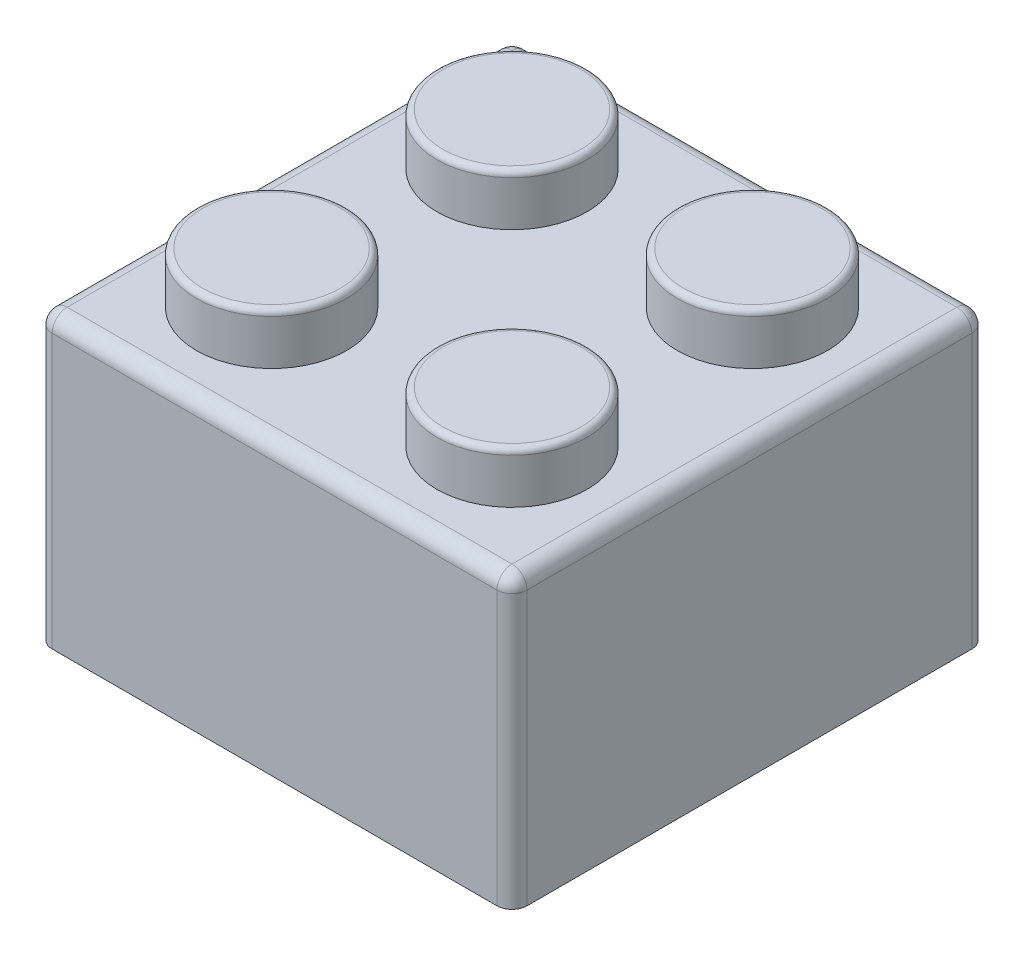
ISO-10303-21;
HEADER;
FILE_DESCRIPTION(('STEP AP214'),'2;1');
FILE_NAME('part.step','',(''),(''),'','','');
FILE_SCHEMA(('AUTOMOTIVE_DESIGN { 1 0 10303 214 1 1 1 1 }'));
ENDSEC;
DATA;
#1=APPLICATION_CONTEXT('core data for automotive mechanical design processes');
#2=APPLICATION_PROTOCOL_DEFINITION('international standard','automotive_design',2000,#1);
#3=PRODUCT_CONTEXT('',#1,'mechanical');
#4=PRODUCT('Part','Part','',(#3));
#5=PRODUCT_RELATED_PRODUCT_CATEGORY('part','',(#4));
#6=PRODUCT_DEFINITION_FORMATION('','',#4);
#7=PRODUCT_DEFINITION_CONTEXT('part definition',#1,'design');
#8=PRODUCT_DEFINITION('design','',#6,#7);
#9=PRODUCT_DEFINITION_SHAPE('','',#8);
#10=(LENGTH_UNIT() NAMED_UNIT(*) SI_UNIT(.MILLI.,.METRE.));
#11=(NAMED_UNIT(*) PLANE_ANGLE_UNIT() SI_UNIT($,.RADIAN.));
#12=(NAMED_UNIT(*) SI_UNIT($,.STERADIAN.) SOLID_ANGLE_UNIT());
#13=UNCERTAINTY_MEASURE_WITH_UNIT(LENGTH_MEASURE(1.E-05),#10,'distance_accuracy_value','');
#14=(GEOMETRIC_REPRESENTATION_CONTEXT(3) GLOBAL_UNCERTAINTY_ASSIGNED_CONTEXT((#13)) GLOBAL_UNIT_ASSIGNED_CONTEXT((#10,
#11,#12)) REPRESENTATION_CONTEXT('',''));
#15=CARTESIAN_POINT('',(0.,0.,0.));
#16=DIRECTION('',(0.,0.,1.));
#17=DIRECTION('',(1.,0.,0.));
#18=AXIS2_PLACEMENT_3D('',#15,#16,#17);
#19=CARTESIAN_POINT('',(4.37456896551724,11.1,5.32801724137931));
#20=DIRECTION('',(0.,1.,0.));
#21=DIRECTION('',(0.,0.,1.));
#22=AXIS2_PLACEMENT_3D('',#19,#20,#21);
#23=TOROIDAL_SURFACE('',#22,2.3,0.2);
#24=CARTESIAN_POINT('',(4.37456896551724,11.1,5.32801724137931));
#25=DIRECTION('',(0.,1.,0.));
#26=DIRECTION('',(0.,0.,1.));
#27=AXIS2_PLACEMENT_3D('',#24,#25,#26);
#28=CIRCLE('',#27,2.5);
#29=CARTESIAN_POINT('',(4.37456896551724,11.1,7.82801724137931));
#30=VERTEX_POINT('',#29);
#31=EDGE_CURVE('E281',#30,#30,#28,.F.);
#32=ORIENTED_EDGE('',*,*,#31,.F.);
#33=EDGE_LOOP('',(#32));
#34=FACE_BOUND('',#33,.T.);
#35=CARTESIAN_POINT('',(4.37456896551724,11.3,5.32801724137931));
#36=DIRECTION('',(0.,1.,0.));
#37=DIRECTION('',(0.,0.,1.));
#38=AXIS2_PLACEMENT_3D('',#35,#36,#37);
#39=CIRCLE('',#38,2.3);
#40=CARTESIAN_POINT('',(4.37456896551724,11.3,7.62801724137931));
#41=VERTEX_POINT('',#40);
#42=EDGE_CURVE('E40',#41,#41,#39,.T.);
#43=ORIENTED_EDGE('',*,*,#42,.F.);
#44=EDGE_LOOP('',(#43));
#45=FACE_BOUND('',#44,.T.);
#46=ADVANCED_FACE('F33',(#34,#45),#23,.T.);
#47=CARTESIAN_POINT('',(4.37456896551724,11.3,5.32801724137931));
#48=DIRECTION('',(0.,1.,0.));
#49=DIRECTION('',(0.,0.,1.));
#50=AXIS2_PLACEMENT_3D('',#47,#48,#49);
#51=PLANE('',#50);
#52=ORIENTED_EDGE('',*,*,#42,.T.);
#53=EDGE_LOOP('',(#52));
#54=FACE_BOUND('',#53,.T.);
#55=ADVANCED_FACE('F286',(#54),#51,.T.);
#56=CARTESIAN_POINT('',(4.37456896551724,11.3,5.32801724137931));
#57=DIRECTION('',(0.,-1.,0.));
#58=DIRECTION('',(0.,0.,-1.));
#59=AXIS2_PLACEMENT_3D('',#56,#57,#58);
#60=CYLINDRICAL_SURFACE('',#59,2.5);
#61=ORIENTED_EDGE('',*,*,#31,.T.);
#62=EDGE_LOOP('',(#61));
#63=FACE_BOUND('',#62,.T.);
#64=CARTESIAN_POINT('',(4.37456896551724,9.6,5.32801724137931));
#65=DIRECTION('',(0.,1.,0.));
#66=DIRECTION('',(0.,0.,1.));
#67=AXIS2_PLACEMENT_3D('',#64,#65,#66);
#68=CIRCLE('',#67,2.5);
#69=CARTESIAN_POINT('',(4.37456896551724,9.6,7.82801724137931));
#70=VERTEX_POINT('',#69);
#71=EDGE_CURVE('E278',#70,#70,#68,.T.);
#72=ORIENTED_EDGE('',*,*,#71,.T.);
#73=EDGE_LOOP('',(#72));
#74=FACE_BOUND('',#73,.T.);
#75=ADVANCED_FACE('F293',(#63,#74),#60,.T.);
#76=CARTESIAN_POINT('',(-3.62543103448276,11.1,5.32801724137931));
#77=DIRECTION('',(0.,1.,0.));
#78=DIRECTION('',(0.,0.,1.));
#79=AXIS2_PLACEMENT_3D('',#76,#77,#78);
#80=TOROIDAL_SURFACE('',#79,2.3,0.2);
#81=CARTESIAN_POINT('',(-3.62543103448276,11.1,5.32801724137931));
#82=DIRECTION('',(0.,1.,0.));
#83=DIRECTION('',(0.,0.,1.));
#84=AXIS2_PLACEMENT_3D('',#81,#82,#83);
#85=CIRCLE('',#84,2.5);
#86=CARTESIAN_POINT('',(-3.62543103448276,11.1,7.82801724137932));
#87=VERTEX_POINT('',#86);
#88=EDGE_CURVE('E272',#87,#87,#85,.F.);
#89=ORIENTED_EDGE('',*,*,#88,.F.);
#90=EDGE_LOOP('',(#89));
#91=FACE_BOUND('',#90,.T.);
#92=CARTESIAN_POINT('',(-3.62543103448276,11.3,5.32801724137931));
#93=DIRECTION('',(0.,1.,0.));
#94=DIRECTION('',(0.,0.,1.));
#95=AXIS2_PLACEMENT_3D('',#92,#93,#94);
#96=CIRCLE('',#95,2.3);
#97=CARTESIAN_POINT('',(-3.62543103448276,11.3,7.62801724137931));
#98=VERTEX_POINT('',#97);
#99=EDGE_CURVE('E275',#98,#98,#96,.T.);
#100=ORIENTED_EDGE('',*,*,#99,.F.);
#101=EDGE_LOOP('',(#100));
#102=FACE_BOUND('',#101,.T.);
#103=ADVANCED_FACE('F298',(#91,#102),#80,.T.);
#104=CARTESIAN_POINT('',(-3.62543103448276,11.3,5.32801724137931));
#105=DIRECTION('',(0.,1.,0.));
#106=DIRECTION('',(0.,0.,1.));
#107=AXIS2_PLACEMENT_3D('',#104,#105,#106);
#108=PLANE('',#107);
#109=ORIENTED_EDGE('',*,*,#99,.T.);
#110=EDGE_LOOP('',(#109));
#111=FACE_BOUND('',#110,.T.);
#112=ADVANCED_FACE('F389',(#111),#108,.T.);
#113=CARTESIAN_POINT('',(-3.62543103448276,11.3,5.32801724137931));
#114=DIRECTION('',(0.,-1.,0.));
#115=DIRECTION('',(0.,0.,-1.));
#116=AXIS2_PLACEMENT_3D('',#113,#114,#115);
#117=CYLINDRICAL_SURFACE('',#116,2.5);
#118=ORIENTED_EDGE('',*,*,#88,.T.);
#119=EDGE_LOOP('',(#118));
#120=FACE_BOUND('',#119,.T.);
#121=CARTESIAN_POINT('',(-3.62543103448276,9.6,5.32801724137931));
#122=DIRECTION('',(0.,1.,0.));
#123=DIRECTION('',(0.,0.,1.));
#124=AXIS2_PLACEMENT_3D('',#121,#122,#123);
#125=CIRCLE('',#124,2.5);
#126=CARTESIAN_POINT('',(-3.62543103448276,9.6,7.82801724137932));
#127=VERTEX_POINT('',#126);
#128=EDGE_CURVE('E269',#127,#127,#125,.T.);
#129=ORIENTED_EDGE('',*,*,#128,.T.);
#130=EDGE_LOOP('',(#129));
#131=FACE_BOUND('',#130,.T.);
#132=ADVANCED_FACE('F333',(#120,#131),#117,.T.);
#133=CARTESIAN_POINT('',(-7.52543103448276,9.6,-6.57198275862069));
#134=DIRECTION('',(1.,0.,0.));
#135=DIRECTION('',(0.,0.,-1.));
#136=AXIS2_PLACEMENT_3D('',#133,#134,#135);
#137=PLANE('',#136);
#138=DIRECTION('',(0.,0.,1.));
#139=VECTOR('',#138,1.);
#140=CARTESIAN_POINT('',(-7.52543103448276,9.1,-6.57198275862069));
#141=LINE('',#140,#139);
#142=CARTESIAN_POINT('',(-7.52543103448276,9.1,8.72801724137931));
#143=VERTEX_POINT('',#142);
#144=CARTESIAN_POINT('',(-7.52543103448276,9.1,-6.07198275862069));
#145=VERTEX_POINT('',#144);
#146=EDGE_CURVE('E213',#143,#145,#141,.F.);
#147=ORIENTED_EDGE('',*,*,#146,.T.);
#148=DIRECTION('',(0.,-1.,0.));
#149=VECTOR('',#148,1.);
#150=CARTESIAN_POINT('',(-7.52543103448276,9.6,-6.07198275862069));
#151=LINE('',#150,#149);
#152=CARTESIAN_POINT('',(-7.52543103448276,0.,-6.07198275862069));
#153=VERTEX_POINT('',#152);
#154=EDGE_CURVE('E215',#145,#153,#151,.T.);
#155=ORIENTED_EDGE('',*,*,#154,.T.);
#156=DIRECTION('',(0.,0.,1.));
#157=VECTOR('',#156,1.);
#158=CARTESIAN_POINT('',(-7.52543103448276,0.,-6.57198275862069));
#159=LINE('',#158,#157);
#160=CARTESIAN_POINT('',(-7.52543103448276,0.,8.72801724137931));
#161=VERTEX_POINT('',#160);
#162=EDGE_CURVE('E177',#153,#161,#159,.T.);
#163=ORIENTED_EDGE('',*,*,#162,.T.);
#164=DIRECTION('',(0.,-1.,0.));
#165=VECTOR('',#164,1.);
#166=CARTESIAN_POINT('',(-7.52543103448276,9.6,8.72801724137931));
#167=LINE('',#166,#165);
#168=EDGE_CURVE('E211',#161,#143,#167,.F.);
#169=ORIENTED_EDGE('',*,*,#168,.T.);
#170=EDGE_LOOP('',(#147,#155,#163,#169));
#171=FACE_BOUND('',#170,.T.);
#172=ADVANCED_FACE('F329',(#171),#137,.F.);
#173=CARTESIAN_POINT('',(-7.52543103448276,9.6,9.22801724137931));
#174=DIRECTION('',(0.,0.,-1.));
#175=DIRECTION('',(-1.,0.,0.));
#176=AXIS2_PLACEMENT_3D('',#173,#174,#175);
#177=PLANE('',#176);
#178=DIRECTION('',(1.,0.,0.));
#179=VECTOR('',#178,1.);
#180=CARTESIAN_POINT('',(-7.52543103448276,0.,9.22801724137931));
#181=LINE('',#180,#179);
#182=CARTESIAN_POINT('',(-7.02543103448276,0.,9.22801724137931));
#183=VERTEX_POINT('',#182);
#184=CARTESIAN_POINT('',(7.77456896551725,0.,9.22801724137931));
#185=VERTEX_POINT('',#184);
#186=EDGE_CURVE('E180',#183,#185,#181,.T.);
#187=ORIENTED_EDGE('',*,*,#186,.T.);
#188=DIRECTION('',(0.,-1.,0.));
#189=VECTOR('',#188,1.);
#190=CARTESIAN_POINT('',(7.77456896551725,9.6,9.22801724137931));
#191=LINE('',#190,#189);
#192=CARTESIAN_POINT('',(7.77456896551725,9.1,9.22801724137931));
#193=VERTEX_POINT('',#192);
#194=EDGE_CURVE('E221',#185,#193,#191,.F.);
#195=ORIENTED_EDGE('',*,*,#194,.T.);
#196=DIRECTION('',(1.,0.,0.));
#197=VECTOR('',#196,1.);
#198=CARTESIAN_POINT('',(-7.52543103448276,9.1,9.22801724137931));
#199=LINE('',#198,#197);
#200=CARTESIAN_POINT('',(-7.02543103448276,9.1,9.22801724137931));
#201=VERTEX_POINT('',#200);
#202=EDGE_CURVE('E219',#193,#201,#199,.F.);
#203=ORIENTED_EDGE('',*,*,#202,.T.);
#204=DIRECTION('',(0.,-1.,0.));
#205=VECTOR('',#204,1.);
#206=CARTESIAN_POINT('',(-7.02543103448276,9.6,9.22801724137931));
#207=LINE('',#206,#205);
#208=EDGE_CURVE('E217',#201,#183,#207,.T.);
#209=ORIENTED_EDGE('',*,*,#208,.T.);
#210=EDGE_LOOP('',(#187,#195,#203,#209));
#211=FACE_BOUND('',#210,.T.);
#212=ADVANCED_FACE('F325',(#211),#177,.F.);
#213=CARTESIAN_POINT('',(8.27456896551725,9.6,-6.57198275862069));
#214=DIRECTION('',(-1.,0.,0.));
#215=DIRECTION('',(0.,0.,1.));
#216=AXIS2_PLACEMENT_3D('',#213,#214,#215);
#217=PLANE('',#216);
#218=DIRECTION('',(0.,0.,-1.));
#219=VECTOR('',#218,1.);
#220=CARTESIAN_POINT('',(8.27456896551725,0.,-6.57198275862069));
#221=LINE('',#220,#219);
#222=CARTESIAN_POINT('',(8.27456896551725,0.,8.72801724137931));
#223=VERTEX_POINT('',#222);
#224=CARTESIAN_POINT('',(8.27456896551725,0.,-6.07198275862069));
#225=VERTEX_POINT('',#224);
#226=EDGE_CURVE('E184',#223,#225,#221,.T.);
#227=ORIENTED_EDGE('',*,*,#226,.T.);
#228=DIRECTION('',(0.,-1.,0.));
#229=VECTOR('',#228,1.);
#230=CARTESIAN_POINT('',(8.27456896551725,9.6,-6.07198275862069));
#231=LINE('',#230,#229);
#232=CARTESIAN_POINT('',(8.27456896551725,9.1,-6.07198275862069));
#233=VERTEX_POINT('',#232);
#234=EDGE_CURVE('E209',#225,#233,#231,.F.);
#235=ORIENTED_EDGE('',*,*,#234,.T.);
#236=DIRECTION('',(0.,0.,-1.));
#237=VECTOR('',#236,1.);
#238=CARTESIAN_POINT('',(8.27456896551725,9.1,9.22801724137931));
#239=LINE('',#238,#237);
#240=CARTESIAN_POINT('',(8.27456896551725,9.1,8.72801724137931));
#241=VERTEX_POINT('',#240);
#242=EDGE_CURVE('E205',#233,#241,#239,.F.);
#243=ORIENTED_EDGE('',*,*,#242,.T.);
#244=DIRECTION('',(0.,-1.,0.));
#245=VECTOR('',#244,1.);
#246=CARTESIAN_POINT('',(8.27456896551725,9.6,8.72801724137931));
#247=LINE('',#246,#245);
#248=EDGE_CURVE('E207',#241,#223,#247,.T.);
#249=ORIENTED_EDGE('',*,*,#248,.T.);
#250=EDGE_LOOP('',(#227,#235,#243,#249));
#251=FACE_BOUND('',#250,.T.);
#252=ADVANCED_FACE('F315',(#251),#217,.F.);
#253=CARTESIAN_POINT('',(-7.52543103448276,9.6,-6.57198275862069));
#254=DIRECTION('',(0.,0.,1.));
#255=DIRECTION('',(1.,0.,0.));
#256=AXIS2_PLACEMENT_3D('',#253,#254,#255);
#257=PLANE('',#256);
#258=DIRECTION('',(-1.,0.,0.));
#259=VECTOR('',#258,1.);
#260=CARTESIAN_POINT('',(8.27456896551725,9.1,-6.57198275862069));
#261=LINE('',#260,#259);
#262=CARTESIAN_POINT('',(-7.02543103448276,9.1,-6.57198275862069));
#263=VERTEX_POINT('',#262);
#264=CARTESIAN_POINT('',(7.77456896551724,9.1,-6.57198275862069));
#265=VERTEX_POINT('',#264);
#266=EDGE_CURVE('E190',#263,#265,#261,.F.);
#267=ORIENTED_EDGE('',*,*,#266,.T.);
#268=DIRECTION('',(0.,-1.,0.));
#269=VECTOR('',#268,1.);
#270=CARTESIAN_POINT('',(7.77456896551724,9.6,-6.57198275862069));
#271=LINE('',#270,#269);
#272=CARTESIAN_POINT('',(7.77456896551724,0.,-6.57198275862069));
#273=VERTEX_POINT('',#272);
#274=EDGE_CURVE('E194',#265,#273,#271,.T.);
#275=ORIENTED_EDGE('',*,*,#274,.T.);
#276=DIRECTION('',(-1.,0.,0.));
#277=VECTOR('',#276,1.);
#278=CARTESIAN_POINT('',(-7.52543103448276,0.,-6.57198275862069));
#279=LINE('',#278,#277);
#280=CARTESIAN_POINT('',(-7.02543103448276,0.,-6.57198275862069));
#281=VERTEX_POINT('',#280);
#282=EDGE_CURVE('E187',#273,#281,#279,.T.);
#283=ORIENTED_EDGE('',*,*,#282,.T.);
#284=DIRECTION('',(0.,-1.,0.));
#285=VECTOR('',#284,1.);
#286=CARTESIAN_POINT('',(-7.02543103448276,9.6,-6.57198275862069));
#287=LINE('',#286,#285);
#288=EDGE_CURVE('E192',#281,#263,#287,.F.);
#289=ORIENTED_EDGE('',*,*,#288,.T.);
#290=EDGE_LOOP('',(#267,#275,#283,#289));
#291=FACE_BOUND('',#290,.T.);
#292=ADVANCED_FACE('F305',(#291),#257,.F.);
#293=CARTESIAN_POINT('',(0.,9.6,0.));
#294=DIRECTION('',(0.,1.,0.));
#295=DIRECTION('',(0.,0.,1.));
#296=AXIS2_PLACEMENT_3D('',#293,#294,#295);
#297=PLANE('',#296);
#298=CARTESIAN_POINT('',(4.37456896551724,9.6,-2.67198275862069));
#299=DIRECTION('',(0.,1.,0.));
#300=DIRECTION('',(0.,0.,1.));
#301=AXIS2_PLACEMENT_3D('',#298,#299,#300);
#302=CIRCLE('',#301,2.5);
#303=CARTESIAN_POINT('',(4.37456896551724,9.6,-0.171982758620687));
#304=VERTEX_POINT('',#303);
#305=EDGE_CURVE('E679',#304,#304,#302,.T.);
#306=ORIENTED_EDGE('',*,*,#305,.F.);
#307=EDGE_LOOP('',(#306));
#308=FACE_BOUND('',#307,.T.);
#309=CARTESIAN_POINT('',(-3.62543103448276,9.6,-2.67198275862069));
#310=DIRECTION('',(0.,1.,0.));
#311=DIRECTION('',(0.,0.,1.));
#312=AXIS2_PLACEMENT_3D('',#309,#310,#311);
#313=CIRCLE('',#312,2.5);
#314=CARTESIAN_POINT('',(-3.62543103448276,9.6,-0.171982758620686));
#315=VERTEX_POINT('',#314);
#316=EDGE_CURVE('E161',#315,#315,#313,.T.);
#317=ORIENTED_EDGE('',*,*,#316,.F.);
#318=EDGE_LOOP('',(#317));
#319=FACE_BOUND('',#318,.T.);
#320=DIRECTION('',(1.,0.,0.));
#321=VECTOR('',#320,1.);
#322=CARTESIAN_POINT('',(8.27456896551725,9.6,8.72801724137931));
#323=LINE('',#322,#321);
#324=CARTESIAN_POINT('',(-7.02543103448276,9.6,8.72801724137931));
#325=VERTEX_POINT('',#324);
#326=CARTESIAN_POINT('',(7.77456896551725,9.6,8.72801724137931));
#327=VERTEX_POINT('',#326);
#328=EDGE_CURVE('E223',#325,#327,#323,.T.);
#329=ORIENTED_EDGE('',*,*,#328,.T.);
#330=DIRECTION('',(0.,0.,-1.));
#331=VECTOR('',#330,1.);
#332=CARTESIAN_POINT('',(7.77456896551725,9.6,-6.57198275862069));
#333=LINE('',#332,#331);
#334=CARTESIAN_POINT('',(7.77456896551725,9.6,-6.07198275862069));
#335=VERTEX_POINT('',#334);
#336=EDGE_CURVE('E229',#327,#335,#333,.T.);
#337=ORIENTED_EDGE('',*,*,#336,.T.);
#338=DIRECTION('',(-1.,0.,0.));
#339=VECTOR('',#338,1.);
#340=CARTESIAN_POINT('',(-7.52543103448276,9.6,-6.07198275862069));
#341=LINE('',#340,#339);
#342=CARTESIAN_POINT('',(-7.02543103448276,9.6,-6.07198275862069));
#343=VERTEX_POINT('',#342);
#344=EDGE_CURVE('E227',#335,#343,#341,.T.);
#345=ORIENTED_EDGE('',*,*,#344,.T.);
#346=DIRECTION('',(0.,0.,1.));
#347=VECTOR('',#346,1.);
#348=CARTESIAN_POINT('',(-7.02543103448276,9.6,9.22801724137931));
#349=LINE('',#348,#347);
#350=EDGE_CURVE('E225',#343,#325,#349,.T.);
#351=ORIENTED_EDGE('',*,*,#350,.T.);
#352=EDGE_LOOP('',(#329,#337,#345,#351));
#353=FACE_BOUND('',#352,.T.);
#354=ORIENTED_EDGE('',*,*,#128,.F.);
#355=EDGE_LOOP('',(#354));
#356=FACE_BOUND('',#355,.T.);
#357=ORIENTED_EDGE('',*,*,#71,.F.);
#358=EDGE_LOOP('',(#357));
#359=FACE_BOUND('',#358,.T.);
#360=ADVANCED_FACE('F302',(#308,#319,#353,#356,#359),#297,.T.);
#361=CARTESIAN_POINT('',(0.,0.,0.));
#362=DIRECTION('',(0.,1.,0.));
#363=DIRECTION('',(0.,0.,1.));
#364=AXIS2_PLACEMENT_3D('',#361,#362,#363);
#365=PLANE('',#364);
#366=DIRECTION('',(-1.,0.,0.));
#367=VECTOR('',#366,1.);
#368=CARTESIAN_POINT('',(6.78456896551725,0.,7.73801724137931));
#369=LINE('',#368,#367);
#370=CARTESIAN_POINT('',(6.78456896551725,0.,7.73801724137931));
#371=VERTEX_POINT('',#370);
#372=CARTESIAN_POINT('',(-6.03543103448276,0.,7.73801724137931));
#373=VERTEX_POINT('',#372);
#374=EDGE_CURVE('E167',#371,#373,#369,.T.);
#375=ORIENTED_EDGE('',*,*,#374,.F.);
#376=DIRECTION('',(0.,0.,1.));
#377=VECTOR('',#376,1.);
#378=CARTESIAN_POINT('',(6.78456896551725,0.,7.73801724137931));
#379=LINE('',#378,#377);
#380=CARTESIAN_POINT('',(6.78456896551725,0.,-5.08198275862069));
#381=VERTEX_POINT('',#380);
#382=EDGE_CURVE('E47',#381,#371,#379,.T.);
#383=ORIENTED_EDGE('',*,*,#382,.F.);
#384=DIRECTION('',(1.,0.,0.));
#385=VECTOR('',#384,1.);
#386=CARTESIAN_POINT('',(6.78456896551725,0.,-5.08198275862069));
#387=LINE('',#386,#385);
#388=CARTESIAN_POINT('',(-6.03543103448276,0.,-5.08198275862069));
#389=VERTEX_POINT('',#388);
#390=EDGE_CURVE('E155',#389,#381,#387,.T.);
#391=ORIENTED_EDGE('',*,*,#390,.F.);
#392=DIRECTION('',(0.,0.,-1.));
#393=VECTOR('',#392,1.);
#394=CARTESIAN_POINT('',(-6.03543103448276,0.,7.73801724137931));
#395=LINE('',#394,#393);
#396=EDGE_CURVE('E158',#373,#389,#395,.T.);
#397=ORIENTED_EDGE('',*,*,#396,.F.);
#398=EDGE_LOOP('',(#375,#383,#391,#397));
#399=FACE_BOUND('',#398,.T.);
#400=ORIENTED_EDGE('',*,*,#282,.F.);
#401=CARTESIAN_POINT('',(7.77456896551724,0.,-6.07198275862069));
#402=DIRECTION('',(0.,1.,0.));
#403=DIRECTION('',(0.,0.,1.));
#404=AXIS2_PLACEMENT_3D('',#401,#402,#403);
#405=CIRCLE('',#404,0.5);
#406=EDGE_CURVE('E203',#273,#225,#405,.F.);
#407=ORIENTED_EDGE('',*,*,#406,.T.);
#408=ORIENTED_EDGE('',*,*,#226,.F.);
#409=CARTESIAN_POINT('',(7.77456896551725,0.,8.72801724137931));
#410=DIRECTION('',(0.,1.,0.));
#411=DIRECTION('',(0.,0.,1.));
#412=AXIS2_PLACEMENT_3D('',#409,#410,#411);
#413=CIRCLE('',#412,0.5);
#414=EDGE_CURVE('E199',#223,#185,#413,.F.);
#415=ORIENTED_EDGE('',*,*,#414,.T.);
#416=ORIENTED_EDGE('',*,*,#186,.F.);
#417=CARTESIAN_POINT('',(-7.02543103448276,0.,8.72801724137931));
#418=DIRECTION('',(0.,1.,0.));
#419=DIRECTION('',(0.,0.,1.));
#420=AXIS2_PLACEMENT_3D('',#417,#418,#419);
#421=CIRCLE('',#420,0.5);
#422=EDGE_CURVE('E197',#183,#161,#421,.F.);
#423=ORIENTED_EDGE('',*,*,#422,.T.);
#424=ORIENTED_EDGE('',*,*,#162,.F.);
#425=CARTESIAN_POINT('',(-7.02543103448276,0.,-6.07198275862069));
#426=DIRECTION('',(0.,1.,0.));
#427=DIRECTION('',(0.,0.,1.));
#428=AXIS2_PLACEMENT_3D('',#425,#426,#427);
#429=CIRCLE('',#428,0.5);
#430=EDGE_CURVE('E201',#153,#281,#429,.F.);
#431=ORIENTED_EDGE('',*,*,#430,.T.);
#432=EDGE_LOOP('',(#400,#407,#408,#415,#416,#423,#424,#431));
#433=FACE_BOUND('',#432,.T.);
#434=ADVANCED_FACE('F304',(#399,#433),#365,.F.);
#435=CARTESIAN_POINT('',(-7.02543103448276,9.6,8.72801724137931));
#436=DIRECTION('',(0.,-1.,0.));
#437=DIRECTION('',(0.,0.,-1.));
#438=AXIS2_PLACEMENT_3D('',#435,#436,#437);
#439=CYLINDRICAL_SURFACE('',#438,0.5);
#440=CARTESIAN_POINT('',(-7.02543103448276,9.1,8.72801724137931));
#441=DIRECTION('',(0.,1.,0.));
#442=DIRECTION('',(0.,0.,1.));
#443=AXIS2_PLACEMENT_3D('',#440,#441,#442);
#444=CIRCLE('',#443,0.5);
#445=EDGE_CURVE('E181',#143,#201,#444,.T.);
#446=ORIENTED_EDGE('',*,*,#445,.F.);
#447=ORIENTED_EDGE('',*,*,#168,.F.);
#448=ORIENTED_EDGE('',*,*,#422,.F.);
#449=ORIENTED_EDGE('',*,*,#208,.F.);
#450=EDGE_LOOP('',(#446,#447,#448,#449));
#451=FACE_BOUND('',#450,.T.);
#452=ADVANCED_FACE('F312',(#451),#439,.T.);
#453=CARTESIAN_POINT('',(-7.02543103448276,9.1,8.72801724137931));
#454=DIRECTION('',(0.,0.,1.));
#455=DIRECTION('',(1.,0.,0.));
#456=AXIS2_PLACEMENT_3D('',#453,#454,#455);
#457=SPHERICAL_SURFACE('',#456,0.5);
#458=CARTESIAN_POINT('',(-7.02543103448276,9.1,8.72801724137931));
#459=DIRECTION('',(0.,0.,1.));
#460=DIRECTION('',(1.,0.,0.));
#461=AXIS2_PLACEMENT_3D('',#458,#459,#460);
#462=CIRCLE('',#461,0.5);
#463=EDGE_CURVE('E256',#143,#325,#462,.F.);
#464=ORIENTED_EDGE('',*,*,#463,.F.);
#465=ORIENTED_EDGE('',*,*,#445,.T.);
#466=CARTESIAN_POINT('',(-7.02543103448276,9.1,8.72801724137931));
#467=DIRECTION('',(-1.,0.,0.));
#468=DIRECTION('',(0.,0.,1.));
#469=AXIS2_PLACEMENT_3D('',#466,#467,#468);
#470=CIRCLE('',#469,0.5);
#471=EDGE_CURVE('E259',#325,#201,#470,.F.);
#472=ORIENTED_EDGE('',*,*,#471,.F.);
#473=EDGE_LOOP('',(#464,#465,#472));
#474=FACE_BOUND('',#473,.T.);
#475=ADVANCED_FACE('F373',(#474),#457,.T.);
#476=CARTESIAN_POINT('',(7.77456896551725,9.6,8.72801724137931));
#477=DIRECTION('',(0.,-1.,0.));
#478=DIRECTION('',(0.,0.,-1.));
#479=AXIS2_PLACEMENT_3D('',#476,#477,#478);
#480=CYLINDRICAL_SURFACE('',#479,0.5);
#481=ORIENTED_EDGE('',*,*,#414,.F.);
#482=ORIENTED_EDGE('',*,*,#248,.F.);
#483=CARTESIAN_POINT('',(7.77456896551725,9.1,8.72801724137931));
#484=DIRECTION('',(0.,1.,0.));
#485=DIRECTION('',(0.,0.,1.));
#486=AXIS2_PLACEMENT_3D('',#483,#484,#485);
#487=CIRCLE('',#486,0.5);
#488=EDGE_CURVE('E253',#193,#241,#487,.T.);
#489=ORIENTED_EDGE('',*,*,#488,.F.);
#490=ORIENTED_EDGE('',*,*,#194,.F.);
#491=EDGE_LOOP('',(#481,#482,#489,#490));
#492=FACE_BOUND('',#491,.T.);
#493=ADVANCED_FACE('F369',(#492),#480,.T.);
#494=CARTESIAN_POINT('',(0.,9.1,8.72801724137931));
#495=DIRECTION('',(-1.,0.,0.));
#496=DIRECTION('',(0.,0.,1.));
#497=AXIS2_PLACEMENT_3D('',#494,#495,#496);
#498=CYLINDRICAL_SURFACE('',#497,0.5);
#499=ORIENTED_EDGE('',*,*,#471,.T.);
#500=ORIENTED_EDGE('',*,*,#202,.F.);
#501=CARTESIAN_POINT('',(7.77456896551725,9.1,8.72801724137931));
#502=DIRECTION('',(1.,0.,0.));
#503=DIRECTION('',(0.,0.,-1.));
#504=AXIS2_PLACEMENT_3D('',#501,#502,#503);
#505=CIRCLE('',#504,0.5);
#506=EDGE_CURVE('E250',#327,#193,#505,.T.);
#507=ORIENTED_EDGE('',*,*,#506,.F.);
#508=ORIENTED_EDGE('',*,*,#328,.F.);
#509=EDGE_LOOP('',(#499,#500,#507,#508));
#510=FACE_BOUND('',#509,.T.);
#511=ADVANCED_FACE('F365',(#510),#498,.T.);
#512=CARTESIAN_POINT('',(-7.02543103448276,9.1,0.));
#513=DIRECTION('',(0.,0.,-1.));
#514=DIRECTION('',(-1.,0.,0.));
#515=AXIS2_PLACEMENT_3D('',#512,#513,#514);
#516=CYLINDRICAL_SURFACE('',#515,0.5);
#517=ORIENTED_EDGE('',*,*,#463,.T.);
#518=ORIENTED_EDGE('',*,*,#350,.F.);
#519=CARTESIAN_POINT('',(-7.02543103448276,9.1,-6.07198275862069));
#520=DIRECTION('',(0.,0.,-1.));
#521=DIRECTION('',(-1.,0.,0.));
#522=AXIS2_PLACEMENT_3D('',#519,#520,#521);
#523=CIRCLE('',#522,0.5);
#524=EDGE_CURVE('E247',#145,#343,#523,.T.);
#525=ORIENTED_EDGE('',*,*,#524,.F.);
#526=ORIENTED_EDGE('',*,*,#146,.F.);
#527=EDGE_LOOP('',(#517,#518,#525,#526));
#528=FACE_BOUND('',#527,.T.);
#529=ADVANCED_FACE('F361',(#528),#516,.T.);
#530=CARTESIAN_POINT('',(-7.02543103448276,9.6,-6.07198275862069));
#531=DIRECTION('',(0.,-1.,0.));
#532=DIRECTION('',(0.,0.,-1.));
#533=AXIS2_PLACEMENT_3D('',#530,#531,#532);
#534=CYLINDRICAL_SURFACE('',#533,0.5);
#535=ORIENTED_EDGE('',*,*,#430,.F.);
#536=ORIENTED_EDGE('',*,*,#154,.F.);
#537=CARTESIAN_POINT('',(-7.02543103448276,9.1,-6.07198275862069));
#538=DIRECTION('',(0.,1.,0.));
#539=DIRECTION('',(0.,0.,1.));
#540=AXIS2_PLACEMENT_3D('',#537,#538,#539);
#541=CIRCLE('',#540,0.5);
#542=EDGE_CURVE('E244',#263,#145,#541,.T.);
#543=ORIENTED_EDGE('',*,*,#542,.F.);
#544=ORIENTED_EDGE('',*,*,#288,.F.);
#545=EDGE_LOOP('',(#535,#536,#543,#544));
#546=FACE_BOUND('',#545,.T.);
#547=ADVANCED_FACE('F357',(#546),#534,.T.);
#548=CARTESIAN_POINT('',(7.77456896551725,9.1,8.72801724137931));
#549=DIRECTION('',(0.,0.,1.));
#550=DIRECTION('',(1.,0.,0.));
#551=AXIS2_PLACEMENT_3D('',#548,#549,#550);
#552=SPHERICAL_SURFACE('',#551,0.5);
#553=ORIENTED_EDGE('',*,*,#506,.T.);
#554=ORIENTED_EDGE('',*,*,#488,.T.);
#555=CARTESIAN_POINT('',(7.77456896551725,9.1,8.72801724137931));
#556=DIRECTION('',(0.,0.,1.));
#557=DIRECTION('',(1.,0.,0.));
#558=AXIS2_PLACEMENT_3D('',#555,#556,#557);
#559=CIRCLE('',#558,0.5);
#560=EDGE_CURVE('E241',#327,#241,#559,.F.);
#561=ORIENTED_EDGE('',*,*,#560,.F.);
#562=EDGE_LOOP('',(#553,#554,#561));
#563=FACE_BOUND('',#562,.T.);
#564=ADVANCED_FACE('F353',(#563),#552,.T.);
#565=CARTESIAN_POINT('',(-7.02543103448276,9.1,-6.07198275862069));
#566=DIRECTION('',(0.,0.,1.));
#567=DIRECTION('',(1.,0.,0.));
#568=AXIS2_PLACEMENT_3D('',#565,#566,#567);
#569=SPHERICAL_SURFACE('',#568,0.5);
#570=ORIENTED_EDGE('',*,*,#542,.T.);
#571=ORIENTED_EDGE('',*,*,#524,.T.);
#572=CARTESIAN_POINT('',(-7.02543103448276,9.1,-6.07198275862069));
#573=DIRECTION('',(-1.,0.,0.));
#574=DIRECTION('',(0.,0.,1.));
#575=AXIS2_PLACEMENT_3D('',#572,#573,#574);
#576=CIRCLE('',#575,0.5);
#577=EDGE_CURVE('E238',#263,#343,#576,.F.);
#578=ORIENTED_EDGE('',*,*,#577,.F.);
#579=EDGE_LOOP('',(#570,#571,#578));
#580=FACE_BOUND('',#579,.T.);
#581=ADVANCED_FACE('F349',(#580),#569,.T.);
#582=CARTESIAN_POINT('',(7.77456896551725,9.1,0.));
#583=DIRECTION('',(0.,0.,1.));
#584=DIRECTION('',(1.,0.,0.));
#585=AXIS2_PLACEMENT_3D('',#582,#583,#584);
#586=CYLINDRICAL_SURFACE('',#585,0.5);
#587=ORIENTED_EDGE('',*,*,#560,.T.);
#588=ORIENTED_EDGE('',*,*,#242,.F.);
#589=CARTESIAN_POINT('',(7.77456896551725,9.1,-6.07198275862069));
#590=DIRECTION('',(0.,0.,-1.));
#591=DIRECTION('',(-1.,0.,0.));
#592=AXIS2_PLACEMENT_3D('',#589,#590,#591);
#593=CIRCLE('',#592,0.5);
#594=EDGE_CURVE('E236',#335,#233,#593,.T.);
#595=ORIENTED_EDGE('',*,*,#594,.F.);
#596=ORIENTED_EDGE('',*,*,#336,.F.);
#597=EDGE_LOOP('',(#587,#588,#595,#596));
#598=FACE_BOUND('',#597,.T.);
#599=ADVANCED_FACE('F345',(#598),#586,.T.);
#600=CARTESIAN_POINT('',(0.,9.1,-6.07198275862069));
#601=DIRECTION('',(1.,0.,0.));
#602=DIRECTION('',(0.,0.,-1.));
#603=AXIS2_PLACEMENT_3D('',#600,#601,#602);
#604=CYLINDRICAL_SURFACE('',#603,0.5);
#605=ORIENTED_EDGE('',*,*,#577,.T.);
#606=ORIENTED_EDGE('',*,*,#344,.F.);
#607=CARTESIAN_POINT('',(7.77456896551724,9.1,-6.07198275862069));
#608=DIRECTION('',(1.,0.,0.));
#609=DIRECTION('',(0.,1.,0.));
#610=AXIS2_PLACEMENT_3D('',#607,#608,#609);
#611=CIRCLE('',#610,0.5);
#612=EDGE_CURVE('E55',#265,#335,#611,.T.);
#613=ORIENTED_EDGE('',*,*,#612,.F.);
#614=ORIENTED_EDGE('',*,*,#266,.F.);
#615=EDGE_LOOP('',(#605,#606,#613,#614));
#616=FACE_BOUND('',#615,.T.);
#617=ADVANCED_FACE('F342',(#616),#604,.T.);
#618=CARTESIAN_POINT('',(7.77456896551725,9.1,-6.07198275862069));
#619=DIRECTION('',(0.,0.,1.));
#620=DIRECTION('',(1.,0.,0.));
#621=AXIS2_PLACEMENT_3D('',#618,#619,#620);
#622=SPHERICAL_SURFACE('',#621,0.5);
#623=ORIENTED_EDGE('',*,*,#612,.T.);
#624=ORIENTED_EDGE('',*,*,#594,.T.);
#625=CARTESIAN_POINT('',(7.77456896551725,9.1,-6.07198275862069));
#626=DIRECTION('',(0.,1.,0.));
#627=DIRECTION('',(0.,0.,1.));
#628=AXIS2_PLACEMENT_3D('',#625,#626,#627);
#629=CIRCLE('',#628,0.5);
#630=EDGE_CURVE('E173',#265,#233,#629,.F.);
#631=ORIENTED_EDGE('',*,*,#630,.F.);
#632=EDGE_LOOP('',(#623,#624,#631));
#633=FACE_BOUND('',#632,.T.);
#634=ADVANCED_FACE('F338',(#633),#622,.T.);
#635=CARTESIAN_POINT('',(7.77456896551724,9.6,-6.07198275862069));
#636=DIRECTION('',(0.,-1.,0.));
#637=DIRECTION('',(0.,0.,-1.));
#638=AXIS2_PLACEMENT_3D('',#635,#636,#637);
#639=CYLINDRICAL_SURFACE('',#638,0.5);
#640=ORIENTED_EDGE('',*,*,#630,.T.);
#641=ORIENTED_EDGE('',*,*,#234,.F.);
#642=ORIENTED_EDGE('',*,*,#406,.F.);
#643=ORIENTED_EDGE('',*,*,#274,.F.);
#644=EDGE_LOOP('',(#640,#641,#642,#643));
#645=FACE_BOUND('',#644,.T.);
#646=ADVANCED_FACE('F335',(#645),#639,.T.);
#647=CARTESIAN_POINT('',(6.78456896551725,8.1,7.73801724137931));
#648=DIRECTION('',(1.,0.,0.));
#649=DIRECTION('',(0.,0.,-1.));
#650=AXIS2_PLACEMENT_3D('',#647,#648,#649);
#651=PLANE('',#650);
#652=ORIENTED_EDGE('',*,*,#382,.T.);
#653=DIRECTION('',(0.,-1.,0.));
#654=VECTOR('',#653,1.);
#655=CARTESIAN_POINT('',(6.78456896551725,8.1,7.73801724137931));
#656=LINE('',#655,#654);
#657=CARTESIAN_POINT('',(6.78456896551725,8.1,7.73801724137931));
#658=VERTEX_POINT('',#657);
#659=EDGE_CURVE('E133',#658,#371,#656,.T.);
#660=ORIENTED_EDGE('',*,*,#659,.F.);
#661=DIRECTION('',(0.,0.,1.));
#662=VECTOR('',#661,1.);
#663=CARTESIAN_POINT('',(6.78456896551725,8.1,7.73801724137931));
#664=LINE('',#663,#662);
#665=CARTESIAN_POINT('',(6.78456896551725,8.1,-5.08198275862069));
#666=VERTEX_POINT('',#665);
#667=EDGE_CURVE('E137',#666,#658,#664,.T.);
#668=ORIENTED_EDGE('',*,*,#667,.F.);
#669=DIRECTION('',(0.,-1.,0.));
#670=VECTOR('',#669,1.);
#671=CARTESIAN_POINT('',(6.78456896551725,8.1,-5.08198275862069));
#672=LINE('',#671,#670);
#673=EDGE_CURVE('E171',#666,#381,#672,.T.);
#674=ORIENTED_EDGE('',*,*,#673,.T.);
#675=EDGE_LOOP('',(#652,#660,#668,#674));
#676=FACE_BOUND('',#675,.T.);
#677=ADVANCED_FACE('F135',(#676),#651,.F.);
#678=CARTESIAN_POINT('',(6.78456896551725,8.1,-5.08198275862069));
#679=DIRECTION('',(0.,0.,-1.));
#680=DIRECTION('',(-1.,0.,0.));
#681=AXIS2_PLACEMENT_3D('',#678,#679,#680);
#682=PLANE('',#681);
#683=ORIENTED_EDGE('',*,*,#390,.T.);
#684=ORIENTED_EDGE('',*,*,#673,.F.);
#685=DIRECTION('',(1.,0.,0.));
#686=VECTOR('',#685,1.);
#687=CARTESIAN_POINT('',(6.78456896551725,8.1,-5.08198275862069));
#688=LINE('',#687,#686);
#689=CARTESIAN_POINT('',(-6.03543103448276,8.1,-5.08198275862069));
#690=VERTEX_POINT('',#689);
#691=EDGE_CURVE('E143',#690,#666,#688,.T.);
#692=ORIENTED_EDGE('',*,*,#691,.F.);
#693=DIRECTION('',(0.,-1.,0.));
#694=VECTOR('',#693,1.);
#695=CARTESIAN_POINT('',(-6.03543103448276,8.1,-5.08198275862069));
#696=LINE('',#695,#694);
#697=EDGE_CURVE('E174',#690,#389,#696,.T.);
#698=ORIENTED_EDGE('',*,*,#697,.T.);
#699=EDGE_LOOP('',(#683,#684,#692,#698));
#700=FACE_BOUND('',#699,.T.);
#701=ADVANCED_FACE('F518',(#700),#682,.F.);
#702=CARTESIAN_POINT('',(-6.03543103448276,8.1,7.73801724137931));
#703=DIRECTION('',(-1.,0.,0.));
#704=DIRECTION('',(0.,0.,1.));
#705=AXIS2_PLACEMENT_3D('',#702,#703,#704);
#706=PLANE('',#705);
#707=ORIENTED_EDGE('',*,*,#396,.T.);
#708=ORIENTED_EDGE('',*,*,#697,.F.);
#709=DIRECTION('',(0.,0.,-1.));
#710=VECTOR('',#709,1.);
#711=CARTESIAN_POINT('',(-6.03543103448276,8.1,7.73801724137931));
#712=LINE('',#711,#710);
#713=CARTESIAN_POINT('',(-6.03543103448276,8.1,7.73801724137931));
#714=VERTEX_POINT('',#713);
#715=EDGE_CURVE('E151',#714,#690,#712,.T.);
#716=ORIENTED_EDGE('',*,*,#715,.F.);
#717=DIRECTION('',(0.,-1.,0.));
#718=VECTOR('',#717,1.);
#719=CARTESIAN_POINT('',(-6.03543103448276,8.1,7.73801724137931));
#720=LINE('',#719,#718);
#721=EDGE_CURVE('E142',#714,#373,#720,.T.);
#722=ORIENTED_EDGE('',*,*,#721,.T.);
#723=EDGE_LOOP('',(#707,#708,#716,#722));
#724=FACE_BOUND('',#723,.T.);
#725=ADVANCED_FACE('F526',(#724),#706,.F.);
#726=CARTESIAN_POINT('',(6.78456896551725,8.1,7.73801724137931));
#727=DIRECTION('',(0.,0.,1.));
#728=DIRECTION('',(1.,0.,0.));
#729=AXIS2_PLACEMENT_3D('',#726,#727,#728);
#730=PLANE('',#729);
#731=ORIENTED_EDGE('',*,*,#374,.T.);
#732=ORIENTED_EDGE('',*,*,#721,.F.);
#733=DIRECTION('',(-1.,0.,0.));
#734=VECTOR('',#733,1.);
#735=CARTESIAN_POINT('',(6.78456896551725,8.1,7.73801724137931));
#736=LINE('',#735,#734);
#737=EDGE_CURVE('E146',#658,#714,#736,.T.);
#738=ORIENTED_EDGE('',*,*,#737,.F.);
#739=ORIENTED_EDGE('',*,*,#659,.T.);
#740=EDGE_LOOP('',(#731,#732,#738,#739));
#741=FACE_BOUND('',#740,.T.);
#742=ADVANCED_FACE('F147',(#741),#730,.F.);
#743=CARTESIAN_POINT('',(0.,8.1,0.));
#744=DIRECTION('',(0.,1.,0.));
#745=DIRECTION('',(0.,0.,1.));
#746=AXIS2_PLACEMENT_3D('',#743,#744,#745);
#747=PLANE('',#746);
#748=CARTESIAN_POINT('',(0.374568965517249,8.1,1.32801724137931));
#749=DIRECTION('',(0.,1.,0.));
#750=DIRECTION('',(0.,0.,1.));
#751=AXIS2_PLACEMENT_3D('',#748,#749,#750);
#752=CIRCLE('',#751,3.155);
#753=CARTESIAN_POINT('',(0.374568965517249,8.1,4.48301724137931));
#754=VERTEX_POINT('',#753);
#755=EDGE_CURVE('E11',#754,#754,#752,.F.);
#756=ORIENTED_EDGE('',*,*,#755,.F.);
#757=EDGE_LOOP('',(#756));
#758=FACE_BOUND('',#757,.T.);
#759=ORIENTED_EDGE('',*,*,#667,.T.);
#760=ORIENTED_EDGE('',*,*,#737,.T.);
#761=ORIENTED_EDGE('',*,*,#715,.T.);
#762=ORIENTED_EDGE('',*,*,#691,.T.);
#763=EDGE_LOOP('',(#759,#760,#761,#762));
#764=FACE_BOUND('',#763,.T.);
#765=ADVANCED_FACE('F153',(#758,#764),#747,.F.);
#766=CARTESIAN_POINT('',(-3.62543103448276,11.3,-2.67198275862069));
#767=DIRECTION('',(0.,-1.,0.));
#768=DIRECTION('',(0.,0.,-1.));
#769=AXIS2_PLACEMENT_3D('',#766,#767,#768);
#770=CYLINDRICAL_SURFACE('',#769,2.5);
#771=CARTESIAN_POINT('',(-3.62543103448276,11.1,-2.67198275862069));
#772=DIRECTION('',(0.,1.,0.));
#773=DIRECTION('',(0.,0.,1.));
#774=AXIS2_PLACEMENT_3D('',#771,#772,#773);
#775=CIRCLE('',#774,2.5);
#776=CARTESIAN_POINT('',(-3.62543103448276,11.1,-0.171982758620686));
#777=VERTEX_POINT('',#776);
#778=EDGE_CURVE('E266',#777,#777,#775,.F.);
#779=ORIENTED_EDGE('',*,*,#778,.T.);
#780=EDGE_LOOP('',(#779));
#781=FACE_BOUND('',#780,.T.);
#782=ORIENTED_EDGE('',*,*,#316,.T.);
#783=EDGE_LOOP('',(#782));
#784=FACE_BOUND('',#783,.T.);
#785=ADVANCED_FACE('F550',(#781,#784),#770,.T.);
#786=CARTESIAN_POINT('',(-3.62543103448276,11.3,-2.67198275862069));
#787=DIRECTION('',(0.,1.,0.));
#788=DIRECTION('',(0.,0.,1.));
#789=AXIS2_PLACEMENT_3D('',#786,#787,#788);
#790=PLANE('',#789);
#791=CARTESIAN_POINT('',(-3.62543103448276,11.3,-2.67198275862069));
#792=DIRECTION('',(0.,1.,0.));
#793=DIRECTION('',(0.,0.,1.));
#794=AXIS2_PLACEMENT_3D('',#791,#792,#793);
#795=CIRCLE('',#794,2.3);
#796=CARTESIAN_POINT('',(-3.62543103448276,11.3,-0.371982758620686));
#797=VERTEX_POINT('',#796);
#798=EDGE_CURVE('E232',#797,#797,#795,.T.);
#799=ORIENTED_EDGE('',*,*,#798,.T.);
#800=EDGE_LOOP('',(#799));
#801=FACE_BOUND('',#800,.T.);
#802=ADVANCED_FACE('F385',(#801),#790,.T.);
#803=CARTESIAN_POINT('',(-3.62543103448276,11.1,-2.67198275862069));
#804=DIRECTION('',(0.,1.,0.));
#805=DIRECTION('',(0.,0.,1.));
#806=AXIS2_PLACEMENT_3D('',#803,#804,#805);
#807=TOROIDAL_SURFACE('',#806,2.3,0.2);
#808=ORIENTED_EDGE('',*,*,#778,.F.);
#809=EDGE_LOOP('',(#808));
#810=FACE_BOUND('',#809,.T.);
#811=ORIENTED_EDGE('',*,*,#798,.F.);
#812=EDGE_LOOP('',(#811));
#813=FACE_BOUND('',#812,.T.);
#814=ADVANCED_FACE('F381',(#810,#813),#807,.T.);
#815=CARTESIAN_POINT('',(4.37456896551724,11.3,-2.67198275862069));
#816=DIRECTION('',(0.,-1.,0.));
#817=DIRECTION('',(0.,0.,-1.));
#818=AXIS2_PLACEMENT_3D('',#815,#816,#817);
#819=CYLINDRICAL_SURFACE('',#818,2.5);
#820=CARTESIAN_POINT('',(4.37456896551724,11.1,-2.67198275862069));
#821=DIRECTION('',(0.,1.,0.));
#822=DIRECTION('',(0.,0.,1.));
#823=AXIS2_PLACEMENT_3D('',#820,#821,#822);
#824=CIRCLE('',#823,2.5);
#825=CARTESIAN_POINT('',(4.37456896551724,11.1,-0.171982758620687));
#826=VERTEX_POINT('',#825);
#827=EDGE_CURVE('E686',#826,#826,#824,.F.);
#828=ORIENTED_EDGE('',*,*,#827,.T.);
#829=EDGE_LOOP('',(#828));
#830=FACE_BOUND('',#829,.T.);
#831=ORIENTED_EDGE('',*,*,#305,.T.);
#832=EDGE_LOOP('',(#831));
#833=FACE_BOUND('',#832,.T.);
#834=ADVANCED_FACE('F384',(#830,#833),#819,.T.);
#835=CARTESIAN_POINT('',(4.37456896551724,11.3,-2.67198275862069));
#836=DIRECTION('',(0.,1.,0.));
#837=DIRECTION('',(0.,0.,1.));
#838=AXIS2_PLACEMENT_3D('',#835,#836,#837);
#839=PLANE('',#838);
#840=CARTESIAN_POINT('',(4.37456896551724,11.3,-2.67198275862069));
#841=DIRECTION('',(0.,1.,0.));
#842=DIRECTION('',(0.,0.,1.));
#843=AXIS2_PLACEMENT_3D('',#840,#841,#842);
#844=CIRCLE('',#843,2.3);
#845=CARTESIAN_POINT('',(4.37456896551724,11.3,-0.371982758620687));
#846=VERTEX_POINT('',#845);
#847=EDGE_CURVE('E688',#846,#846,#844,.T.);
#848=ORIENTED_EDGE('',*,*,#847,.T.);
#849=EDGE_LOOP('',(#848));
#850=FACE_BOUND('',#849,.T.);
#851=ADVANCED_FACE('F600',(#850),#839,.T.);
#852=CARTESIAN_POINT('',(4.37456896551724,11.1,-2.67198275862069));
#853=DIRECTION('',(0.,1.,0.));
#854=DIRECTION('',(0.,0.,1.));
#855=AXIS2_PLACEMENT_3D('',#852,#853,#854);
#856=TOROIDAL_SURFACE('',#855,2.3,0.2);
#857=ORIENTED_EDGE('',*,*,#827,.F.);
#858=EDGE_LOOP('',(#857));
#859=FACE_BOUND('',#858,.T.);
#860=ORIENTED_EDGE('',*,*,#847,.F.);
#861=EDGE_LOOP('',(#860));
#862=FACE_BOUND('',#861,.T.);
#863=ADVANCED_FACE('F609',(#859,#862),#856,.T.);
#864=CARTESIAN_POINT('',(0.374568965517249,0.,1.32801724137931));
#865=DIRECTION('',(0.,1.,0.));
#866=DIRECTION('',(0.,0.,1.));
#867=AXIS2_PLACEMENT_3D('',#864,#865,#866);
#868=CYLINDRICAL_SURFACE('',#867,3.155);
#869=CARTESIAN_POINT('',(0.374568965517249,0.,1.32801724137931));
#870=DIRECTION('',(0.,-1.,0.));
#871=DIRECTION('',(0.,0.,-1.));
#872=AXIS2_PLACEMENT_3D('',#869,#870,#871);
#873=CIRCLE('',#872,3.155);
#874=CARTESIAN_POINT('',(0.374568965517249,0.,-1.82698275862069));
#875=VERTEX_POINT('',#874);
#876=EDGE_CURVE('E675',#875,#875,#873,.T.);
#877=ORIENTED_EDGE('',*,*,#876,.F.);
#878=EDGE_LOOP('',(#877));
#879=FACE_BOUND('',#878,.T.);
#880=ORIENTED_EDGE('',*,*,#755,.T.);
#881=EDGE_LOOP('',(#880));
#882=FACE_BOUND('',#881,.T.);
#883=ADVANCED_FACE('F618',(#879,#882),#868,.T.);
#884=CARTESIAN_POINT('',(0.374568965517249,0.,1.32801724137931));
#885=DIRECTION('',(0.,-1.,0.));
#886=DIRECTION('',(0.,0.,-1.));
#887=AXIS2_PLACEMENT_3D('',#884,#885,#886);
#888=PLANE('',#887);
#889=CARTESIAN_POINT('',(0.374568965517249,0.,1.32801724137931));
#890=DIRECTION('',(0.,-1.,0.));
#891=DIRECTION('',(0.,0.,-1.));
#892=AXIS2_PLACEMENT_3D('',#889,#890,#891);
#893=CIRCLE('',#892,2.655);
#894=CARTESIAN_POINT('',(0.374568965517249,0.,-1.32698275862069));
#895=VERTEX_POINT('',#894);
#896=EDGE_CURVE('E676',#895,#895,#893,.T.);
#897=ORIENTED_EDGE('',*,*,#896,.F.);
#898=EDGE_LOOP('',(#897));
#899=FACE_BOUND('',#898,.T.);
#900=ORIENTED_EDGE('',*,*,#876,.T.);
#901=EDGE_LOOP('',(#900));
#902=FACE_BOUND('',#901,.T.);
#903=ADVANCED_FACE('F628',(#899,#902),#888,.T.);
#904=CARTESIAN_POINT('',(0.374568965517249,8.1,1.32801724137931));
#905=DIRECTION('',(0.,-1.,0.));
#906=DIRECTION('',(0.,0.,-1.));
#907=AXIS2_PLACEMENT_3D('',#904,#905,#906);
#908=CYLINDRICAL_SURFACE('',#907,2.655);
#909=CARTESIAN_POINT('',(0.374568965517249,8.1,1.32801724137931));
#910=DIRECTION('',(0.,-1.,0.));
#911=DIRECTION('',(0.,0.,-1.));
#912=AXIS2_PLACEMENT_3D('',#909,#910,#911);
#913=CIRCLE('',#912,2.655);
#914=CARTESIAN_POINT('',(0.374568965517249,8.1,-1.32698275862069));
#915=VERTEX_POINT('',#914);
#916=EDGE_CURVE('E674',#915,#915,#913,.T.);
#917=ORIENTED_EDGE('',*,*,#916,.F.);
#918=EDGE_LOOP('',(#917));
#919=FACE_BOUND('',#918,.T.);
#920=ORIENTED_EDGE('',*,*,#896,.T.);
#921=EDGE_LOOP('',(#920));
#922=FACE_BOUND('',#921,.T.);
#923=ADVANCED_FACE('F637',(#919,#922),#908,.F.);
#924=CARTESIAN_POINT('',(0.374568965517249,8.1,1.32801724137931));
#925=DIRECTION('',(0.,-1.,0.));
#926=DIRECTION('',(0.,0.,-1.));
#927=AXIS2_PLACEMENT_3D('',#924,#925,#926);
#928=PLANE('',#927);
#929=ORIENTED_EDGE('',*,*,#916,.T.);
#930=EDGE_LOOP('',(#929));
#931=FACE_BOUND('',#930,.T.);
#932=ADVANCED_FACE('F646',(#931),#928,.T.);
#933=CLOSED_SHELL('',(#46,#55,#75,#103,#112,#132,#172,#212,#252,#292,#360,#434,#452,#475,#493,
#511,#529,#547,#564,#581,#599,#617,#634,#646,#677,#701,#725,#742,#765,#785,#802,#814,#834,#851,
#863,#883,#903,#923,#932));
#934=MANIFOLD_SOLID_BREP('B2',#933);
#935=ADVANCED_BREP_SHAPE_REPRESENTATION('',(#18,#934),#14);
#936=SHAPE_DEFINITION_REPRESENTATION(#9,#935);
ENDSEC;
END-ISO-10303-21;
